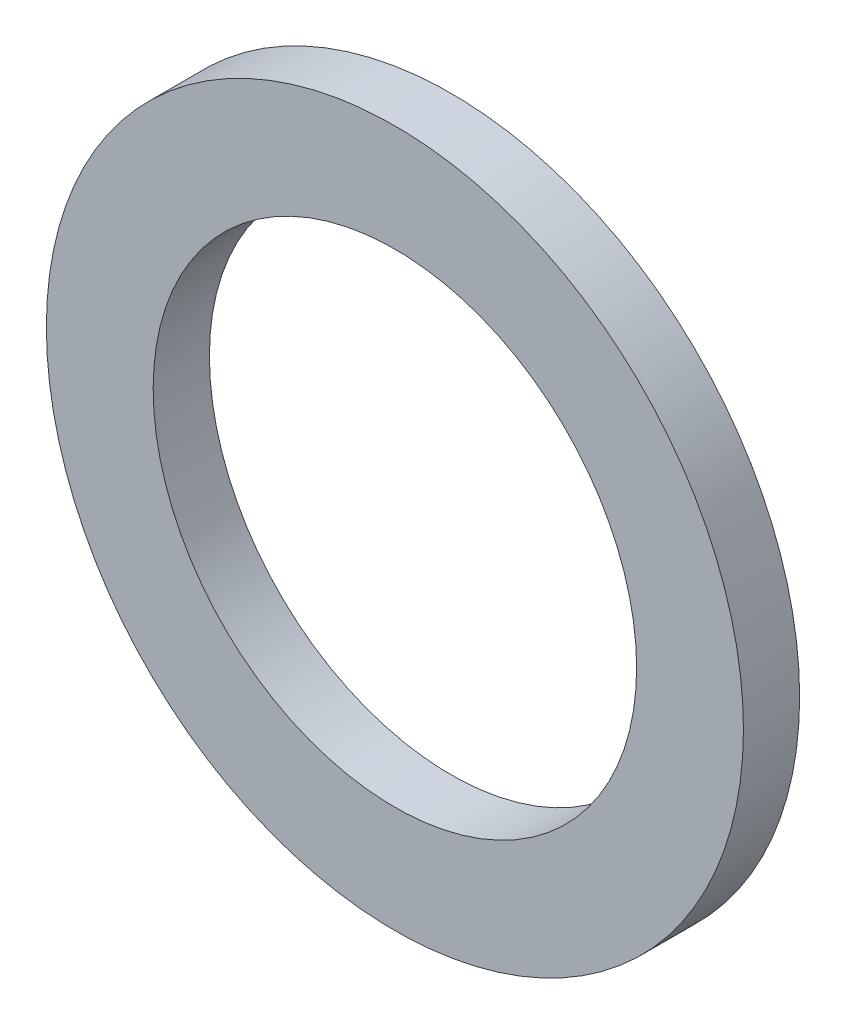
ISO-10303-21;
HEADER;
FILE_DESCRIPTION(('STEP AP214'),'2;1');
FILE_NAME('part.step','',(''),(''),'','','');
FILE_SCHEMA(('AUTOMOTIVE_DESIGN { 1 0 10303 214 1 1 1 1 }'));
ENDSEC;
DATA;
#1=APPLICATION_CONTEXT('core data for automotive mechanical design processes');
#2=APPLICATION_PROTOCOL_DEFINITION('international standard','automotive_design',2000,#1);
#3=PRODUCT_CONTEXT('',#1,'mechanical');
#4=PRODUCT('Part','Part','',(#3));
#5=PRODUCT_RELATED_PRODUCT_CATEGORY('part','',(#4));
#6=PRODUCT_DEFINITION_FORMATION('','',#4);
#7=PRODUCT_DEFINITION_CONTEXT('part definition',#1,'design');
#8=PRODUCT_DEFINITION('design','',#6,#7);
#9=PRODUCT_DEFINITION_SHAPE('','',#8);
#10=(LENGTH_UNIT() NAMED_UNIT(*) SI_UNIT(.MILLI.,.METRE.));
#11=(NAMED_UNIT(*) PLANE_ANGLE_UNIT() SI_UNIT($,.RADIAN.));
#12=(NAMED_UNIT(*) SI_UNIT($,.STERADIAN.) SOLID_ANGLE_UNIT());
#13=UNCERTAINTY_MEASURE_WITH_UNIT(LENGTH_MEASURE(1.E-05),#10,'distance_accuracy_value','');
#14=(GEOMETRIC_REPRESENTATION_CONTEXT(3) GLOBAL_UNCERTAINTY_ASSIGNED_CONTEXT((#13)) GLOBAL_UNIT_ASSIGNED_CONTEXT((#10,
#11,#12)) REPRESENTATION_CONTEXT('',''));
#15=CARTESIAN_POINT('',(0.,0.,0.));
#16=DIRECTION('',(0.,0.,1.));
#17=DIRECTION('',(1.,0.,0.));
#18=AXIS2_PLACEMENT_3D('',#15,#16,#17);
#19=CARTESIAN_POINT('',(0.,0.,5.));
#20=DIRECTION('',(0.,0.,1.));
#21=DIRECTION('',(1.,0.,0.));
#22=AXIS2_PLACEMENT_3D('',#19,#20,#21);
#23=PLANE('',#22);
#24=CARTESIAN_POINT('',(0.,0.,5.));
#25=DIRECTION('',(0.,0.,1.));
#26=DIRECTION('',(1.,0.,0.));
#27=AXIS2_PLACEMENT_3D('',#24,#25,#26);
#28=CIRCLE('',#27,31.);
#29=CARTESIAN_POINT('',(31.,0.,5.));
#30=VERTEX_POINT('',#29);
#31=EDGE_CURVE('E10',#30,#30,#28,.T.);
#32=ORIENTED_EDGE('',*,*,#31,.T.);
#33=EDGE_LOOP('',(#32));
#34=FACE_BOUND('',#33,.T.);
#35=CARTESIAN_POINT('',(0.,0.,5.));
#36=DIRECTION('',(0.,0.,1.));
#37=DIRECTION('',(1.,0.,0.));
#38=AXIS2_PLACEMENT_3D('',#35,#36,#37);
#39=CIRCLE('',#38,21.5);
#40=CARTESIAN_POINT('',(21.5,0.,5.));
#41=VERTEX_POINT('',#40);
#42=EDGE_CURVE('E50',#41,#41,#39,.T.);
#43=ORIENTED_EDGE('',*,*,#42,.F.);
#44=EDGE_LOOP('',(#43));
#45=FACE_BOUND('',#44,.T.);
#46=ADVANCED_FACE('F39',(#34,#45),#23,.T.);
#47=CARTESIAN_POINT('',(0.,0.,0.));
#48=DIRECTION('',(0.,0.,1.));
#49=DIRECTION('',(1.,0.,0.));
#50=AXIS2_PLACEMENT_3D('',#47,#48,#49);
#51=PLANE('',#50);
#52=CARTESIAN_POINT('',(0.,0.,0.));
#53=DIRECTION('',(0.,0.,1.));
#54=DIRECTION('',(1.,0.,0.));
#55=AXIS2_PLACEMENT_3D('',#52,#53,#54);
#56=CIRCLE('',#55,31.);
#57=CARTESIAN_POINT('',(31.,0.,0.));
#58=VERTEX_POINT('',#57);
#59=EDGE_CURVE('E43',#58,#58,#56,.T.);
#60=ORIENTED_EDGE('',*,*,#59,.F.);
#61=EDGE_LOOP('',(#60));
#62=FACE_BOUND('',#61,.T.);
#63=CARTESIAN_POINT('',(0.,0.,0.));
#64=DIRECTION('',(0.,0.,1.));
#65=DIRECTION('',(1.,0.,0.));
#66=AXIS2_PLACEMENT_3D('',#63,#64,#65);
#67=CIRCLE('',#66,21.5);
#68=CARTESIAN_POINT('',(21.5,0.,0.));
#69=VERTEX_POINT('',#68);
#70=EDGE_CURVE('E52',#69,#69,#67,.T.);
#71=ORIENTED_EDGE('',*,*,#70,.T.);
#72=EDGE_LOOP('',(#71));
#73=FACE_BOUND('',#72,.T.);
#74=ADVANCED_FACE('F62',(#62,#73),#51,.F.);
#75=CARTESIAN_POINT('',(0.,0.,5.));
#76=DIRECTION('',(0.,0.,-1.));
#77=DIRECTION('',(-1.,0.,0.));
#78=AXIS2_PLACEMENT_3D('',#75,#76,#77);
#79=CYLINDRICAL_SURFACE('',#78,31.);
#80=ORIENTED_EDGE('',*,*,#31,.F.);
#81=EDGE_LOOP('',(#80));
#82=FACE_BOUND('',#81,.T.);
#83=ORIENTED_EDGE('',*,*,#59,.T.);
#84=EDGE_LOOP('',(#83));
#85=FACE_BOUND('',#84,.T.);
#86=ADVANCED_FACE('F41',(#82,#85),#79,.T.);
#87=CARTESIAN_POINT('',(0.,0.,5.));
#88=DIRECTION('',(0.,0.,-1.));
#89=DIRECTION('',(-1.,0.,0.));
#90=AXIS2_PLACEMENT_3D('',#87,#88,#89);
#91=CYLINDRICAL_SURFACE('',#90,21.5);
#92=ORIENTED_EDGE('',*,*,#42,.T.);
#93=EDGE_LOOP('',(#92));
#94=FACE_BOUND('',#93,.T.);
#95=ORIENTED_EDGE('',*,*,#70,.F.);
#96=EDGE_LOOP('',(#95));
#97=FACE_BOUND('',#96,.T.);
#98=ADVANCED_FACE('F58',(#94,#97),#91,.F.);
#99=CLOSED_SHELL('',(#46,#74,#86,#98));
#100=MANIFOLD_SOLID_BREP('B2',#99);
#101=ADVANCED_BREP_SHAPE_REPRESENTATION('',(#18,#100),#14);
#102=SHAPE_DEFINITION_REPRESENTATION(#9,#101);
ENDSEC;
END-ISO-10303-21;
